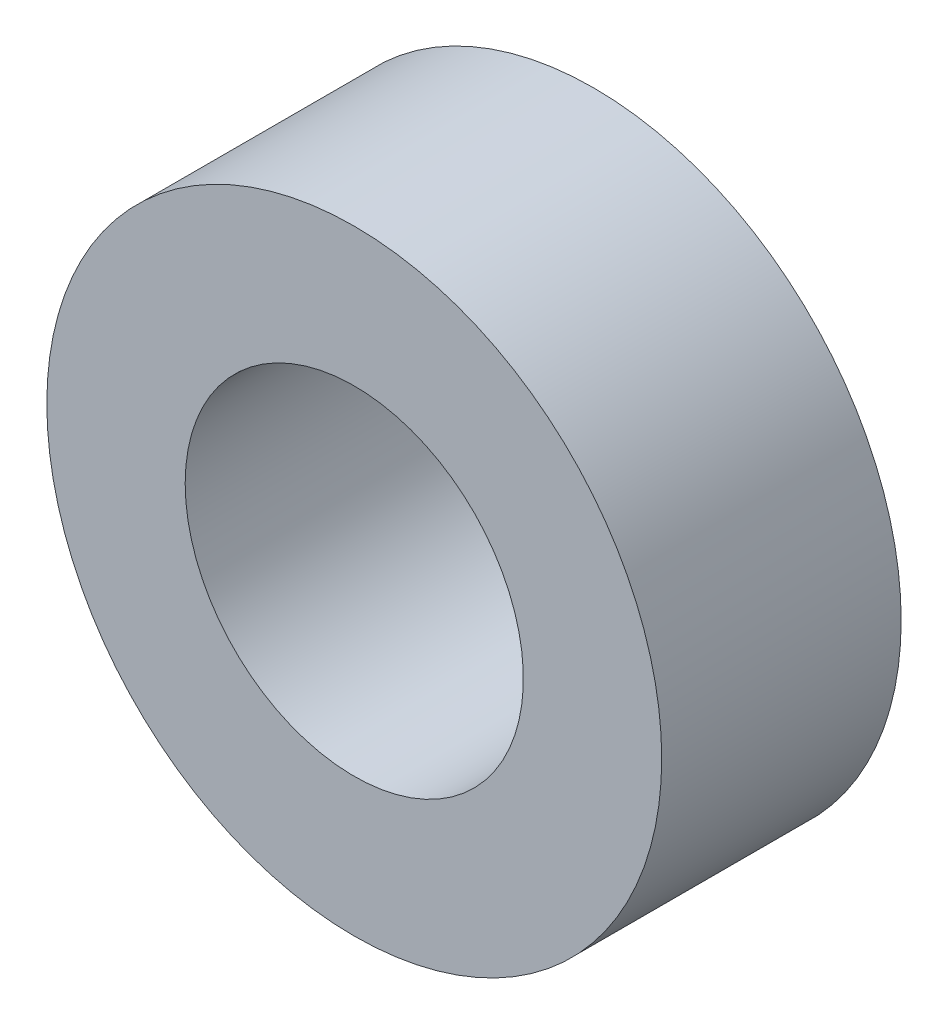
ISO-10303-21;
HEADER;
FILE_DESCRIPTION(('STEP AP214'),'2;1');
FILE_NAME('part.step','',(''),(''),'','','');
FILE_SCHEMA(('AUTOMOTIVE_DESIGN { 1 0 10303 214 1 1 1 1 }'));
ENDSEC;
DATA;
#1=APPLICATION_CONTEXT('core data for automotive mechanical design processes');
#2=APPLICATION_PROTOCOL_DEFINITION('international standard','automotive_design',2000,#1);
#3=PRODUCT_CONTEXT('',#1,'mechanical');
#4=PRODUCT('Part','Part','',(#3));
#5=PRODUCT_RELATED_PRODUCT_CATEGORY('part','',(#4));
#6=PRODUCT_DEFINITION_FORMATION('','',#4);
#7=PRODUCT_DEFINITION_CONTEXT('part definition',#1,'design');
#8=PRODUCT_DEFINITION('design','',#6,#7);
#9=PRODUCT_DEFINITION_SHAPE('','',#8);
#10=(LENGTH_UNIT() NAMED_UNIT(*) SI_UNIT(.MILLI.,.METRE.));
#11=(NAMED_UNIT(*) PLANE_ANGLE_UNIT() SI_UNIT($,.RADIAN.));
#12=(NAMED_UNIT(*) SI_UNIT($,.STERADIAN.) SOLID_ANGLE_UNIT());
#13=UNCERTAINTY_MEASURE_WITH_UNIT(LENGTH_MEASURE(1.E-05),#10,'distance_accuracy_value','');
#14=(GEOMETRIC_REPRESENTATION_CONTEXT(3) GLOBAL_UNCERTAINTY_ASSIGNED_CONTEXT((#13)) GLOBAL_UNIT_ASSIGNED_CONTEXT((#10,
#11,#12)) REPRESENTATION_CONTEXT('',''));
#15=CARTESIAN_POINT('',(0.,0.,0.));
#16=DIRECTION('',(0.,0.,1.));
#17=DIRECTION('',(1.,0.,0.));
#18=AXIS2_PLACEMENT_3D('',#15,#16,#17);
#19=CARTESIAN_POINT('',(0.,0.,3.709253313));
#20=DIRECTION('',(0.,0.,1.));
#21=DIRECTION('',(1.,0.,0.));
#22=AXIS2_PLACEMENT_3D('',#19,#20,#21);
#23=PLANE('',#22);
#24=CARTESIAN_POINT('',(0.,0.,3.709253313));
#25=DIRECTION('',(0.,0.,1.));
#26=DIRECTION('',(1.,0.,0.));
#27=AXIS2_PLACEMENT_3D('',#24,#25,#26);
#28=CIRCLE('',#27,9.525);
#29=CARTESIAN_POINT('',(-9.525,0.,3.709253313));
#30=VERTEX_POINT('',#29);
#31=EDGE_CURVE('E10',#30,#30,#28,.T.);
#32=ORIENTED_EDGE('',*,*,#31,.T.);
#33=EDGE_LOOP('',(#32));
#34=FACE_BOUND('',#33,.T.);
#35=CARTESIAN_POINT('',(0.,0.,3.709253313));
#36=DIRECTION('',(0.,0.,1.));
#37=DIRECTION('',(1.,0.,0.));
#38=AXIS2_PLACEMENT_3D('',#35,#36,#37);
#39=CIRCLE('',#38,5.23875);
#40=CARTESIAN_POINT('',(-5.23875,0.,3.709253313));
#41=VERTEX_POINT('',#40);
#42=EDGE_CURVE('E48',#41,#41,#39,.T.);
#43=ORIENTED_EDGE('',*,*,#42,.F.);
#44=EDGE_LOOP('',(#43));
#45=FACE_BOUND('',#44,.T.);
#46=ADVANCED_FACE('F37',(#34,#45),#23,.T.);
#47=CARTESIAN_POINT('',(0.,0.,-3.709253313));
#48=DIRECTION('',(0.,0.,1.));
#49=DIRECTION('',(1.,0.,0.));
#50=AXIS2_PLACEMENT_3D('',#47,#48,#49);
#51=PLANE('',#50);
#52=CARTESIAN_POINT('',(0.,0.,-3.709253313));
#53=DIRECTION('',(0.,0.,1.));
#54=DIRECTION('',(1.,0.,0.));
#55=AXIS2_PLACEMENT_3D('',#52,#53,#54);
#56=CIRCLE('',#55,9.525);
#57=CARTESIAN_POINT('',(-9.525,0.,-3.709253313));
#58=VERTEX_POINT('',#57);
#59=EDGE_CURVE('E41',#58,#58,#56,.T.);
#60=ORIENTED_EDGE('',*,*,#59,.F.);
#61=EDGE_LOOP('',(#60));
#62=FACE_BOUND('',#61,.T.);
#63=CARTESIAN_POINT('',(0.,0.,-3.709253313));
#64=DIRECTION('',(0.,0.,1.));
#65=DIRECTION('',(1.,0.,0.));
#66=AXIS2_PLACEMENT_3D('',#63,#64,#65);
#67=CIRCLE('',#66,5.23875);
#68=CARTESIAN_POINT('',(-5.23875,0.,-3.709253313));
#69=VERTEX_POINT('',#68);
#70=EDGE_CURVE('E50',#69,#69,#67,.T.);
#71=ORIENTED_EDGE('',*,*,#70,.T.);
#72=EDGE_LOOP('',(#71));
#73=FACE_BOUND('',#72,.T.);
#74=ADVANCED_FACE('F60',(#62,#73),#51,.F.);
#75=CARTESIAN_POINT('',(0.,0.,3.709253313));
#76=DIRECTION('',(0.,0.,-1.));
#77=DIRECTION('',(-1.,0.,0.));
#78=AXIS2_PLACEMENT_3D('',#75,#76,#77);
#79=CYLINDRICAL_SURFACE('',#78,9.525);
#80=CARTESIAN_POINT('',(-9.525,0.,3.709253313));
#81=CARTESIAN_POINT('',(-9.525,0.,3.6319772023125));
#82=CARTESIAN_POINT('',(-9.525,0.,3.554701091625));
#83=CARTESIAN_POINT('',(-9.525,0.,3.40014887025));
#84=CARTESIAN_POINT('',(-9.525,0.,3.3228727595625));
#85=CARTESIAN_POINT('',(-9.525,0.,3.1683205381875));
#86=CARTESIAN_POINT('',(-9.525,0.,3.0910444275));
#87=CARTESIAN_POINT('',(-9.525,0.,2.936492206125));
#88=CARTESIAN_POINT('',(-9.525,0.,2.8592160954375));
#89=CARTESIAN_POINT('',(-9.525,0.,2.7046638740625));
#90=CARTESIAN_POINT('',(-9.525,0.,2.627387763375));
#91=CARTESIAN_POINT('',(-9.525,0.,2.472835542));
#92=CARTESIAN_POINT('',(-9.525,0.,2.3955594313125));
#93=CARTESIAN_POINT('',(-9.525,0.,2.2410072099375));
#94=CARTESIAN_POINT('',(-9.525,0.,2.16373109925));
#95=CARTESIAN_POINT('',(-9.525,0.,2.009178877875));
#96=CARTESIAN_POINT('',(-9.525,0.,1.9319027671875));
#97=CARTESIAN_POINT('',(-9.525,0.,1.7773505458125));
#98=CARTESIAN_POINT('',(-9.525,0.,1.700074435125));
#99=CARTESIAN_POINT('',(-9.525,0.,1.54552221375));
#100=CARTESIAN_POINT('',(-9.525,0.,1.4682461030625));
#101=CARTESIAN_POINT('',(-9.525,0.,1.3136938816875));
#102=CARTESIAN_POINT('',(-9.525,0.,1.236417771));
#103=CARTESIAN_POINT('',(-9.525,0.,1.081865549625));
#104=CARTESIAN_POINT('',(-9.525,0.,1.0045894389375));
#105=CARTESIAN_POINT('',(-9.525,0.,0.850037217562499));
#106=CARTESIAN_POINT('',(-9.525,0.,0.772761106874999));
#107=CARTESIAN_POINT('',(-9.525,0.,0.618208885499999));
#108=CARTESIAN_POINT('',(-9.525,0.,0.540932774812499));
#109=CARTESIAN_POINT('',(-9.525,0.,0.386380553437499));
#110=CARTESIAN_POINT('',(-9.525,0.,0.309104442749999));
#111=CARTESIAN_POINT('',(-9.525,0.,0.154552221374999));
#112=CARTESIAN_POINT('',(-9.525,0.,0.0772761106874992));
#113=CARTESIAN_POINT('',(-9.525,0.,-0.0772761106875005));
#114=CARTESIAN_POINT('',(-9.525,0.,-0.154552221375));
#115=CARTESIAN_POINT('',(-9.525,0.,-0.30910444275));
#116=CARTESIAN_POINT('',(-9.525,0.,-0.3863805534375));
#117=CARTESIAN_POINT('',(-9.525,0.,-0.5409327748125));
#118=CARTESIAN_POINT('',(-9.525,0.,-0.6182088855));
#119=CARTESIAN_POINT('',(-9.525,0.,-0.772761106875));
#120=CARTESIAN_POINT('',(-9.525,0.,-0.8500372175625));
#121=CARTESIAN_POINT('',(-9.525,0.,-1.0045894389375));
#122=CARTESIAN_POINT('',(-9.525,0.,-1.081865549625));
#123=CARTESIAN_POINT('',(-9.525,0.,-1.236417771));
#124=CARTESIAN_POINT('',(-9.525,0.,-1.3136938816875));
#125=CARTESIAN_POINT('',(-9.525,0.,-1.4682461030625));
#126=CARTESIAN_POINT('',(-9.525,0.,-1.54552221375));
#127=CARTESIAN_POINT('',(-9.525,0.,-1.700074435125));
#128=CARTESIAN_POINT('',(-9.525,0.,-1.7773505458125));
#129=CARTESIAN_POINT('',(-9.525,0.,-1.9319027671875));
#130=CARTESIAN_POINT('',(-9.525,0.,-2.009178877875));
#131=CARTESIAN_POINT('',(-9.525,0.,-2.16373109925));
#132=CARTESIAN_POINT('',(-9.525,0.,-2.2410072099375));
#133=CARTESIAN_POINT('',(-9.525,0.,-2.3955594313125));
#134=CARTESIAN_POINT('',(-9.525,0.,-2.472835542));
#135=CARTESIAN_POINT('',(-9.525,0.,-2.627387763375));
#136=CARTESIAN_POINT('',(-9.525,0.,-2.7046638740625));
#137=CARTESIAN_POINT('',(-9.525,0.,-2.8592160954375));
#138=CARTESIAN_POINT('',(-9.525,0.,-2.936492206125));
#139=CARTESIAN_POINT('',(-9.525,0.,-3.0910444275));
#140=CARTESIAN_POINT('',(-9.525,0.,-3.1683205381875));
#141=CARTESIAN_POINT('',(-9.525,0.,-3.3228727595625));
#142=CARTESIAN_POINT('',(-9.525,0.,-3.40014887025));
#143=CARTESIAN_POINT('',(-9.525,0.,-3.554701091625));
#144=CARTESIAN_POINT('',(-9.525,0.,-3.6319772023125));
#145=CARTESIAN_POINT('',(-9.525,0.,-3.709253313));
#146=B_SPLINE_CURVE_WITH_KNOTS('',3,(#80,#81,#82,#83,#84,#85,#86,#87,#88,#89,#90,#91,#92,#93,
#94,#95,#96,#97,#98,#99,#100,#101,#102,#103,#104,#105,#106,#107,#108,#109,#110,#111,#112,#113,
#114,#115,#116,#117,#118,#119,#120,#121,#122,#123,#124,#125,#126,#127,#128,#129,#130,#131,#132,
#133,#134,#135,#136,#137,#138,#139,#140,#141,#142,#143,#144,#145),.UNSPECIFIED.,.F.,.F.,(4,2,2,
2,2,2,2,2,2,2,2,2,2,2,2,2,2,2,2,2,2,2,2,2,2,2,2,2,2,2,2,2,4),(0.,0.2318283320625,0.463656664125,
0.6954849961875,0.92731332825,1.1591416603125,1.390969992375,1.6227983244375,1.8546266565,
2.0864549885625,2.318283320625,2.5501116526875,2.78193998475,3.0137683168125,3.245596648875,
3.4774249809375,3.709253313,3.9410816450625,4.172909977125,4.4047383091875,4.63656664125,
4.8683949733125,5.100223305375,5.3320516374375,5.5638799695,5.7957083015625,6.027536633625,
6.2593649656875,6.49119329775,6.7230216298125,6.954849961875,7.1866782939375,7.418506626),.UNSPECIFIED.);
#147=EDGE_CURVE('BSEAM39',#30,#58,#146,.T.);
#148=ORIENTED_EDGE('',*,*,#31,.F.);
#149=ORIENTED_EDGE('',*,*,#59,.T.);
#150=ORIENTED_EDGE('',*,*,#147,.T.);
#151=ORIENTED_EDGE('',*,*,#147,.F.);
#152=EDGE_LOOP('',(#148,#150,#149,#151));
#153=FACE_BOUND('',#152,.T.);
#154=ADVANCED_FACE('F39',(#153),#79,.T.);
#155=CARTESIAN_POINT('',(0.,0.,3.709253313));
#156=DIRECTION('',(0.,0.,-1.));
#157=DIRECTION('',(-1.,0.,0.));
#158=AXIS2_PLACEMENT_3D('',#155,#156,#157);
#159=CYLINDRICAL_SURFACE('',#158,5.23875);
#160=CARTESIAN_POINT('',(-5.23875,0.,3.709253313));
#161=CARTESIAN_POINT('',(-5.23875,0.,3.6319772023125));
#162=CARTESIAN_POINT('',(-5.23875,0.,3.554701091625));
#163=CARTESIAN_POINT('',(-5.23875,0.,3.40014887025));
#164=CARTESIAN_POINT('',(-5.23875,0.,3.3228727595625));
#165=CARTESIAN_POINT('',(-5.23875,0.,3.1683205381875));
#166=CARTESIAN_POINT('',(-5.23875,0.,3.0910444275));
#167=CARTESIAN_POINT('',(-5.23875,0.,2.936492206125));
#168=CARTESIAN_POINT('',(-5.23875,0.,2.8592160954375));
#169=CARTESIAN_POINT('',(-5.23875,0.,2.7046638740625));
#170=CARTESIAN_POINT('',(-5.23875,0.,2.627387763375));
#171=CARTESIAN_POINT('',(-5.23875,0.,2.472835542));
#172=CARTESIAN_POINT('',(-5.23875,0.,2.3955594313125));
#173=CARTESIAN_POINT('',(-5.23875,0.,2.2410072099375));
#174=CARTESIAN_POINT('',(-5.23875,0.,2.16373109925));
#175=CARTESIAN_POINT('',(-5.23875,0.,2.009178877875));
#176=CARTESIAN_POINT('',(-5.23875,0.,1.9319027671875));
#177=CARTESIAN_POINT('',(-5.23875,0.,1.7773505458125));
#178=CARTESIAN_POINT('',(-5.23875,0.,1.700074435125));
#179=CARTESIAN_POINT('',(-5.23875,0.,1.54552221375));
#180=CARTESIAN_POINT('',(-5.23875,0.,1.4682461030625));
#181=CARTESIAN_POINT('',(-5.23875,0.,1.3136938816875));
#182=CARTESIAN_POINT('',(-5.23875,0.,1.236417771));
#183=CARTESIAN_POINT('',(-5.23875,0.,1.081865549625));
#184=CARTESIAN_POINT('',(-5.23875,0.,1.0045894389375));
#185=CARTESIAN_POINT('',(-5.23875,0.,0.850037217562499));
#186=CARTESIAN_POINT('',(-5.23875,0.,0.772761106874999));
#187=CARTESIAN_POINT('',(-5.23875,0.,0.618208885499999));
#188=CARTESIAN_POINT('',(-5.23875,0.,0.540932774812499));
#189=CARTESIAN_POINT('',(-5.23875,0.,0.386380553437499));
#190=CARTESIAN_POINT('',(-5.23875,0.,0.309104442749999));
#191=CARTESIAN_POINT('',(-5.23875,0.,0.154552221374999));
#192=CARTESIAN_POINT('',(-5.23875,0.,0.0772761106874992));
#193=CARTESIAN_POINT('',(-5.23875,0.,-0.0772761106875005));
#194=CARTESIAN_POINT('',(-5.23875,0.,-0.154552221375));
#195=CARTESIAN_POINT('',(-5.23875,0.,-0.30910444275));
#196=CARTESIAN_POINT('',(-5.23875,0.,-0.3863805534375));
#197=CARTESIAN_POINT('',(-5.23875,0.,-0.5409327748125));
#198=CARTESIAN_POINT('',(-5.23875,0.,-0.6182088855));
#199=CARTESIAN_POINT('',(-5.23875,0.,-0.772761106875));
#200=CARTESIAN_POINT('',(-5.23875,0.,-0.8500372175625));
#201=CARTESIAN_POINT('',(-5.23875,0.,-1.0045894389375));
#202=CARTESIAN_POINT('',(-5.23875,0.,-1.081865549625));
#203=CARTESIAN_POINT('',(-5.23875,0.,-1.236417771));
#204=CARTESIAN_POINT('',(-5.23875,0.,-1.3136938816875));
#205=CARTESIAN_POINT('',(-5.23875,0.,-1.4682461030625));
#206=CARTESIAN_POINT('',(-5.23875,0.,-1.54552221375));
#207=CARTESIAN_POINT('',(-5.23875,0.,-1.700074435125));
#208=CARTESIAN_POINT('',(-5.23875,0.,-1.7773505458125));
#209=CARTESIAN_POINT('',(-5.23875,0.,-1.9319027671875));
#210=CARTESIAN_POINT('',(-5.23875,0.,-2.009178877875));
#211=CARTESIAN_POINT('',(-5.23875,0.,-2.16373109925));
#212=CARTESIAN_POINT('',(-5.23875,0.,-2.2410072099375));
#213=CARTESIAN_POINT('',(-5.23875,0.,-2.3955594313125));
#214=CARTESIAN_POINT('',(-5.23875,0.,-2.472835542));
#215=CARTESIAN_POINT('',(-5.23875,0.,-2.627387763375));
#216=CARTESIAN_POINT('',(-5.23875,0.,-2.7046638740625));
#217=CARTESIAN_POINT('',(-5.23875,0.,-2.8592160954375));
#218=CARTESIAN_POINT('',(-5.23875,0.,-2.936492206125));
#219=CARTESIAN_POINT('',(-5.23875,0.,-3.0910444275));
#220=CARTESIAN_POINT('',(-5.23875,0.,-3.1683205381875));
#221=CARTESIAN_POINT('',(-5.23875,0.,-3.3228727595625));
#222=CARTESIAN_POINT('',(-5.23875,0.,-3.40014887025));
#223=CARTESIAN_POINT('',(-5.23875,0.,-3.554701091625));
#224=CARTESIAN_POINT('',(-5.23875,0.,-3.6319772023125));
#225=CARTESIAN_POINT('',(-5.23875,0.,-3.709253313));
#226=B_SPLINE_CURVE_WITH_KNOTS('',3,(#160,#161,#162,#163,#164,#165,#166,#167,#168,#169,#170,
#171,#172,#173,#174,#175,#176,#177,#178,#179,#180,#181,#182,#183,#184,#185,#186,#187,#188,#189,
#190,#191,#192,#193,#194,#195,#196,#197,#198,#199,#200,#201,#202,#203,#204,#205,#206,#207,#208,
#209,#210,#211,#212,#213,#214,#215,#216,#217,#218,#219,#220,#221,#222,#223,#224,#225),
.UNSPECIFIED.,.F.,.F.,(4,2,2,2,2,2,2,2,2,2,2,2,2,2,2,2,2,2,2,2,2,2,2,2,2,2,2,2,2,2,2,2,4),(0.,
0.2318283320625,0.463656664125,0.6954849961875,0.92731332825,1.1591416603125,1.390969992375,
1.6227983244375,1.8546266565,2.0864549885625,2.318283320625,2.5501116526875,2.78193998475,
3.0137683168125,3.245596648875,3.4774249809375,3.709253313,3.9410816450625,4.172909977125,
4.4047383091875,4.63656664125,4.8683949733125,5.100223305375,5.3320516374375,5.5638799695,
5.7957083015625,6.027536633625,6.2593649656875,6.49119329775,6.7230216298125,6.954849961875,
7.1866782939375,7.418506626),.UNSPECIFIED.);
#227=EDGE_CURVE('BSEAM56',#41,#69,#226,.T.);
#228=ORIENTED_EDGE('',*,*,#42,.T.);
#229=ORIENTED_EDGE('',*,*,#70,.F.);
#230=ORIENTED_EDGE('',*,*,#227,.T.);
#231=ORIENTED_EDGE('',*,*,#227,.F.);
#232=EDGE_LOOP('',(#228,#230,#229,#231));
#233=FACE_BOUND('',#232,.T.);
#234=ADVANCED_FACE('F56',(#233),#159,.F.);
#235=CLOSED_SHELL('',(#46,#74,#154,#234));
#236=MANIFOLD_SOLID_BREP('B2',#235);
#237=ADVANCED_BREP_SHAPE_REPRESENTATION('',(#18,#236),#14);
#238=SHAPE_DEFINITION_REPRESENTATION(#9,#237);
ENDSEC;
END-ISO-10303-21;
